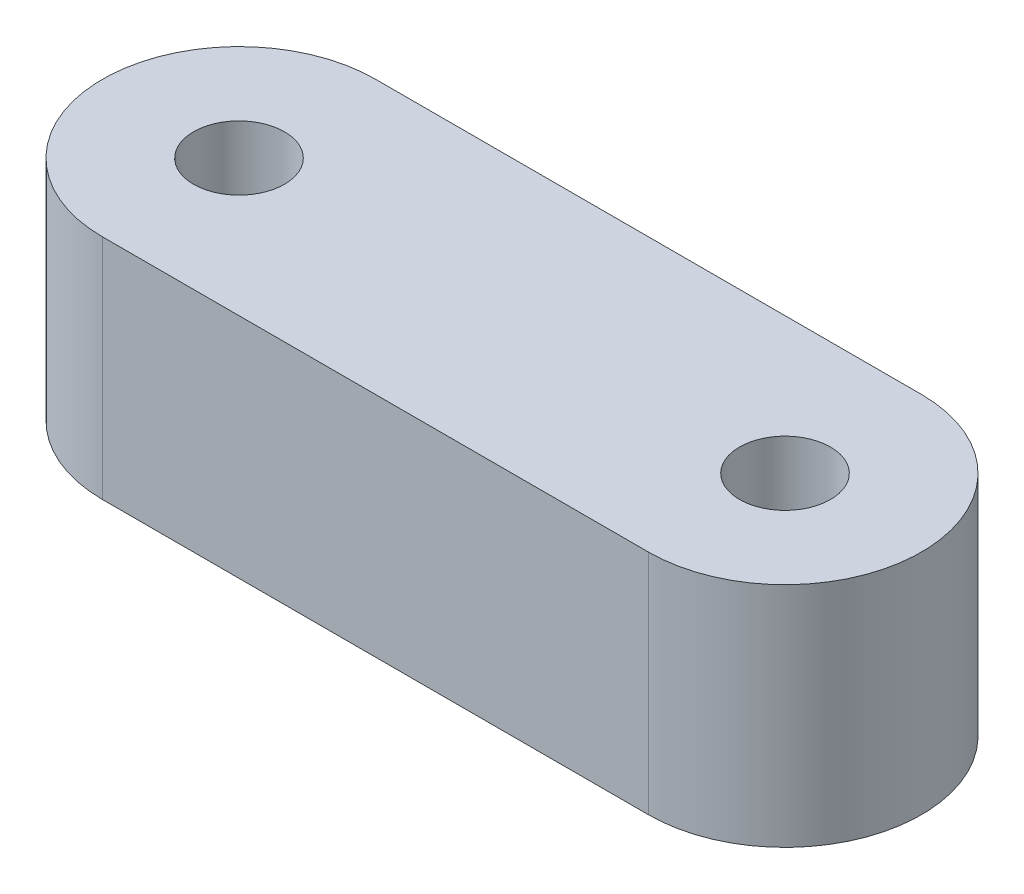
ISO-10303-21;
HEADER;
FILE_DESCRIPTION(('STEP AP214'),'2;1');
FILE_NAME('part.step','',(''),(''),'','','');
FILE_SCHEMA(('AUTOMOTIVE_DESIGN { 1 0 10303 214 1 1 1 1 }'));
ENDSEC;
DATA;
#1=APPLICATION_CONTEXT('core data for automotive mechanical design processes');
#2=APPLICATION_PROTOCOL_DEFINITION('international standard','automotive_design',2000,#1);
#3=PRODUCT_CONTEXT('',#1,'mechanical');
#4=PRODUCT('Part','Part','',(#3));
#5=PRODUCT_RELATED_PRODUCT_CATEGORY('part','',(#4));
#6=PRODUCT_DEFINITION_FORMATION('','',#4);
#7=PRODUCT_DEFINITION_CONTEXT('part definition',#1,'design');
#8=PRODUCT_DEFINITION('design','',#6,#7);
#9=PRODUCT_DEFINITION_SHAPE('','',#8);
#10=(LENGTH_UNIT() NAMED_UNIT(*) SI_UNIT(.MILLI.,.METRE.));
#11=(NAMED_UNIT(*) PLANE_ANGLE_UNIT() SI_UNIT($,.RADIAN.));
#12=(NAMED_UNIT(*) SI_UNIT($,.STERADIAN.) SOLID_ANGLE_UNIT());
#13=UNCERTAINTY_MEASURE_WITH_UNIT(LENGTH_MEASURE(1.E-05),#10,'distance_accuracy_value','');
#14=(GEOMETRIC_REPRESENTATION_CONTEXT(3) GLOBAL_UNCERTAINTY_ASSIGNED_CONTEXT((#13)) GLOBAL_UNIT_ASSIGNED_CONTEXT((#10,
#11,#12)) REPRESENTATION_CONTEXT('',''));
#15=CARTESIAN_POINT('',(0.,0.,0.));
#16=DIRECTION('',(0.,0.,1.));
#17=DIRECTION('',(1.,0.,0.));
#18=AXIS2_PLACEMENT_3D('',#15,#16,#17);
#19=CARTESIAN_POINT('',(-50.8,12.7,0.));
#20=DIRECTION('',(0.,-1.,0.));
#21=DIRECTION('',(0.,0.,-1.));
#22=AXIS2_PLACEMENT_3D('',#19,#20,#21);
#23=CYLINDRICAL_SURFACE('',#22,7.62);
#24=CARTESIAN_POINT('',(-50.8,0.,0.));
#25=DIRECTION('',(0.,1.,0.));
#26=DIRECTION('',(0.,0.,1.));
#27=AXIS2_PLACEMENT_3D('',#24,#25,#26);
#28=CIRCLE('',#27,7.62);
#29=CARTESIAN_POINT('',(-50.8,0.,-7.62));
#30=VERTEX_POINT('',#29);
#31=CARTESIAN_POINT('',(-50.8,0.,7.62));
#32=VERTEX_POINT('',#31);
#33=EDGE_CURVE('E102',#30,#32,#28,.T.);
#34=ORIENTED_EDGE('',*,*,#33,.T.);
#35=DIRECTION('',(0.,-1.,0.));
#36=VECTOR('',#35,1.);
#37=CARTESIAN_POINT('',(-50.8,12.7,7.62));
#38=LINE('',#37,#36);
#39=CARTESIAN_POINT('',(-50.8,12.7,7.62));
#40=VERTEX_POINT('',#39);
#41=EDGE_CURVE('E11',#40,#32,#38,.T.);
#42=ORIENTED_EDGE('',*,*,#41,.F.);
#43=CARTESIAN_POINT('',(-50.8,12.7,0.));
#44=DIRECTION('',(0.,1.,0.));
#45=DIRECTION('',(0.,0.,1.));
#46=AXIS2_PLACEMENT_3D('',#43,#44,#45);
#47=CIRCLE('',#46,7.62);
#48=CARTESIAN_POINT('',(-50.8,12.7,-7.62));
#49=VERTEX_POINT('',#48);
#50=EDGE_CURVE('E90',#49,#40,#47,.T.);
#51=ORIENTED_EDGE('',*,*,#50,.F.);
#52=DIRECTION('',(0.,-1.,0.));
#53=VECTOR('',#52,1.);
#54=CARTESIAN_POINT('',(-50.8,12.7,-7.62));
#55=LINE('',#54,#53);
#56=EDGE_CURVE('E98',#49,#30,#55,.T.);
#57=ORIENTED_EDGE('',*,*,#56,.T.);
#58=EDGE_LOOP('',(#34,#42,#51,#57));
#59=FACE_BOUND('',#58,.T.);
#60=ADVANCED_FACE('F39',(#59),#23,.T.);
#61=CARTESIAN_POINT('',(-50.8,12.7,7.62));
#62=DIRECTION('',(0.,0.,-1.));
#63=DIRECTION('',(-1.,0.,0.));
#64=AXIS2_PLACEMENT_3D('',#61,#62,#63);
#65=PLANE('',#64);
#66=DIRECTION('',(1.,0.,0.));
#67=VECTOR('',#66,1.);
#68=CARTESIAN_POINT('',(-50.8,0.,7.62));
#69=LINE('',#68,#67);
#70=CARTESIAN_POINT('',(-20.32,0.,7.62));
#71=VERTEX_POINT('',#70);
#72=EDGE_CURVE('E94',#32,#71,#69,.T.);
#73=ORIENTED_EDGE('',*,*,#72,.T.);
#74=DIRECTION('',(0.,-1.,0.));
#75=VECTOR('',#74,1.);
#76=CARTESIAN_POINT('',(-20.32,12.7,7.62));
#77=LINE('',#76,#75);
#78=CARTESIAN_POINT('',(-20.32,12.7,7.62));
#79=VERTEX_POINT('',#78);
#80=EDGE_CURVE('E47',#79,#71,#77,.T.);
#81=ORIENTED_EDGE('',*,*,#80,.F.);
#82=DIRECTION('',(1.,0.,0.));
#83=VECTOR('',#82,1.);
#84=CARTESIAN_POINT('',(-50.8,12.7,7.62));
#85=LINE('',#84,#83);
#86=EDGE_CURVE('E85',#40,#79,#85,.T.);
#87=ORIENTED_EDGE('',*,*,#86,.F.);
#88=ORIENTED_EDGE('',*,*,#41,.T.);
#89=EDGE_LOOP('',(#73,#81,#87,#88));
#90=FACE_BOUND('',#89,.T.);
#91=ADVANCED_FACE('F93',(#90),#65,.F.);
#92=CARTESIAN_POINT('',(-20.32,12.7,0.));
#93=DIRECTION('',(0.,-1.,0.));
#94=DIRECTION('',(0.,0.,-1.));
#95=AXIS2_PLACEMENT_3D('',#92,#93,#94);
#96=CYLINDRICAL_SURFACE('',#95,7.62);
#97=CARTESIAN_POINT('',(-20.32,0.,0.));
#98=DIRECTION('',(0.,1.,0.));
#99=DIRECTION('',(0.,0.,1.));
#100=AXIS2_PLACEMENT_3D('',#97,#98,#99);
#101=CIRCLE('',#100,7.62);
#102=CARTESIAN_POINT('',(-20.32,0.,-7.62));
#103=VERTEX_POINT('',#102);
#104=EDGE_CURVE('E72',#71,#103,#101,.T.);
#105=ORIENTED_EDGE('',*,*,#104,.T.);
#106=DIRECTION('',(0.,-1.,0.));
#107=VECTOR('',#106,1.);
#108=CARTESIAN_POINT('',(-20.32,12.7,-7.62));
#109=LINE('',#108,#107);
#110=CARTESIAN_POINT('',(-20.32,12.7,-7.62));
#111=VERTEX_POINT('',#110);
#112=EDGE_CURVE('E95',#111,#103,#109,.T.);
#113=ORIENTED_EDGE('',*,*,#112,.F.);
#114=CARTESIAN_POINT('',(-20.32,12.7,0.));
#115=DIRECTION('',(0.,1.,0.));
#116=DIRECTION('',(0.,0.,1.));
#117=AXIS2_PLACEMENT_3D('',#114,#115,#116);
#118=CIRCLE('',#117,7.62);
#119=EDGE_CURVE('E88',#79,#111,#118,.T.);
#120=ORIENTED_EDGE('',*,*,#119,.F.);
#121=ORIENTED_EDGE('',*,*,#80,.T.);
#122=EDGE_LOOP('',(#105,#113,#120,#121));
#123=FACE_BOUND('',#122,.T.);
#124=ADVANCED_FACE('F96',(#123),#96,.T.);
#125=CARTESIAN_POINT('',(-50.8,12.7,-7.62));
#126=DIRECTION('',(0.,0.,1.));
#127=DIRECTION('',(1.,0.,0.));
#128=AXIS2_PLACEMENT_3D('',#125,#126,#127);
#129=PLANE('',#128);
#130=DIRECTION('',(-1.,0.,0.));
#131=VECTOR('',#130,1.);
#132=CARTESIAN_POINT('',(-50.8,0.,-7.62));
#133=LINE('',#132,#131);
#134=EDGE_CURVE('E78',#103,#30,#133,.T.);
#135=ORIENTED_EDGE('',*,*,#134,.T.);
#136=ORIENTED_EDGE('',*,*,#56,.F.);
#137=DIRECTION('',(-1.,0.,0.));
#138=VECTOR('',#137,1.);
#139=CARTESIAN_POINT('',(-50.8,12.7,-7.62));
#140=LINE('',#139,#138);
#141=EDGE_CURVE('E55',#111,#49,#140,.T.);
#142=ORIENTED_EDGE('',*,*,#141,.F.);
#143=ORIENTED_EDGE('',*,*,#112,.T.);
#144=EDGE_LOOP('',(#135,#136,#142,#143));
#145=FACE_BOUND('',#144,.T.);
#146=ADVANCED_FACE('F110',(#145),#129,.F.);
#147=CARTESIAN_POINT('',(-50.8,12.7,0.));
#148=DIRECTION('',(0.,1.,0.));
#149=DIRECTION('',(0.,0.,1.));
#150=AXIS2_PLACEMENT_3D('',#147,#148,#149);
#151=PLANE('',#150);
#152=CARTESIAN_POINT('',(-50.8,12.7,0.));
#153=DIRECTION('',(0.,1.,0.));
#154=DIRECTION('',(0.,0.,1.));
#155=AXIS2_PLACEMENT_3D('',#152,#153,#154);
#156=CIRCLE('',#155,2.54);
#157=CARTESIAN_POINT('',(-50.8,12.7,2.54));
#158=VERTEX_POINT('',#157);
#159=EDGE_CURVE('E122',#158,#158,#156,.T.);
#160=ORIENTED_EDGE('',*,*,#159,.F.);
#161=EDGE_LOOP('',(#160));
#162=FACE_BOUND('',#161,.T.);
#163=CARTESIAN_POINT('',(-20.32,12.7,0.));
#164=DIRECTION('',(0.,1.,0.));
#165=DIRECTION('',(0.,0.,-1.));
#166=AXIS2_PLACEMENT_3D('',#163,#164,#165);
#167=CIRCLE('',#166,2.54);
#168=CARTESIAN_POINT('',(-20.32,12.7,-2.54));
#169=VERTEX_POINT('',#168);
#170=EDGE_CURVE('E119',#169,#169,#167,.T.);
#171=ORIENTED_EDGE('',*,*,#170,.F.);
#172=EDGE_LOOP('',(#171));
#173=FACE_BOUND('',#172,.T.);
#174=ORIENTED_EDGE('',*,*,#50,.T.);
#175=ORIENTED_EDGE('',*,*,#86,.T.);
#176=ORIENTED_EDGE('',*,*,#119,.T.);
#177=ORIENTED_EDGE('',*,*,#141,.T.);
#178=EDGE_LOOP('',(#174,#175,#176,#177));
#179=FACE_BOUND('',#178,.T.);
#180=ADVANCED_FACE('F86',(#162,#173,#179),#151,.T.);
#181=CARTESIAN_POINT('',(-50.8,0.,0.));
#182=DIRECTION('',(0.,1.,0.));
#183=DIRECTION('',(0.,0.,1.));
#184=AXIS2_PLACEMENT_3D('',#181,#182,#183);
#185=PLANE('',#184);
#186=CARTESIAN_POINT('',(-50.8,0.,0.));
#187=DIRECTION('',(0.,1.,0.));
#188=DIRECTION('',(0.,0.,1.));
#189=AXIS2_PLACEMENT_3D('',#186,#187,#188);
#190=CIRCLE('',#189,2.54);
#191=CARTESIAN_POINT('',(-50.8,0.,2.54));
#192=VERTEX_POINT('',#191);
#193=EDGE_CURVE('E105',#192,#192,#190,.T.);
#194=ORIENTED_EDGE('',*,*,#193,.T.);
#195=EDGE_LOOP('',(#194));
#196=FACE_BOUND('',#195,.T.);
#197=CARTESIAN_POINT('',(-20.32,0.,0.));
#198=DIRECTION('',(0.,1.,0.));
#199=DIRECTION('',(0.,0.,-1.));
#200=AXIS2_PLACEMENT_3D('',#197,#198,#199);
#201=CIRCLE('',#200,2.54);
#202=CARTESIAN_POINT('',(-20.32,0.,-2.54));
#203=VERTEX_POINT('',#202);
#204=EDGE_CURVE('E116',#203,#203,#201,.T.);
#205=ORIENTED_EDGE('',*,*,#204,.T.);
#206=EDGE_LOOP('',(#205));
#207=FACE_BOUND('',#206,.T.);
#208=ORIENTED_EDGE('',*,*,#33,.F.);
#209=ORIENTED_EDGE('',*,*,#134,.F.);
#210=ORIENTED_EDGE('',*,*,#104,.F.);
#211=ORIENTED_EDGE('',*,*,#72,.F.);
#212=EDGE_LOOP('',(#208,#209,#210,#211));
#213=FACE_BOUND('',#212,.T.);
#214=ADVANCED_FACE('F113',(#196,#207,#213),#185,.F.);
#215=CARTESIAN_POINT('',(-20.32,0.,0.));
#216=DIRECTION('',(0.,1.,0.));
#217=DIRECTION('',(0.,0.,1.));
#218=AXIS2_PLACEMENT_3D('',#215,#216,#217);
#219=CYLINDRICAL_SURFACE('',#218,2.54);
#220=ORIENTED_EDGE('',*,*,#204,.F.);
#221=EDGE_LOOP('',(#220));
#222=FACE_BOUND('',#221,.T.);
#223=ORIENTED_EDGE('',*,*,#170,.T.);
#224=EDGE_LOOP('',(#223));
#225=FACE_BOUND('',#224,.T.);
#226=ADVANCED_FACE('F133',(#222,#225),#219,.F.);
#227=CARTESIAN_POINT('',(-50.8,0.,0.));
#228=DIRECTION('',(0.,1.,0.));
#229=DIRECTION('',(0.,0.,1.));
#230=AXIS2_PLACEMENT_3D('',#227,#228,#229);
#231=CYLINDRICAL_SURFACE('',#230,2.54);
#232=ORIENTED_EDGE('',*,*,#193,.F.);
#233=EDGE_LOOP('',(#232));
#234=FACE_BOUND('',#233,.T.);
#235=ORIENTED_EDGE('',*,*,#159,.T.);
#236=EDGE_LOOP('',(#235));
#237=FACE_BOUND('',#236,.T.);
#238=ADVANCED_FACE('F130',(#234,#237),#231,.F.);
#239=CLOSED_SHELL('',(#60,#91,#124,#146,#180,#214,#226,#238));
#240=MANIFOLD_SOLID_BREP('B2',#239);
#241=ADVANCED_BREP_SHAPE_REPRESENTATION('',(#18,#240),#14);
#242=SHAPE_DEFINITION_REPRESENTATION(#9,#241);
ENDSEC;
END-ISO-10303-21;
